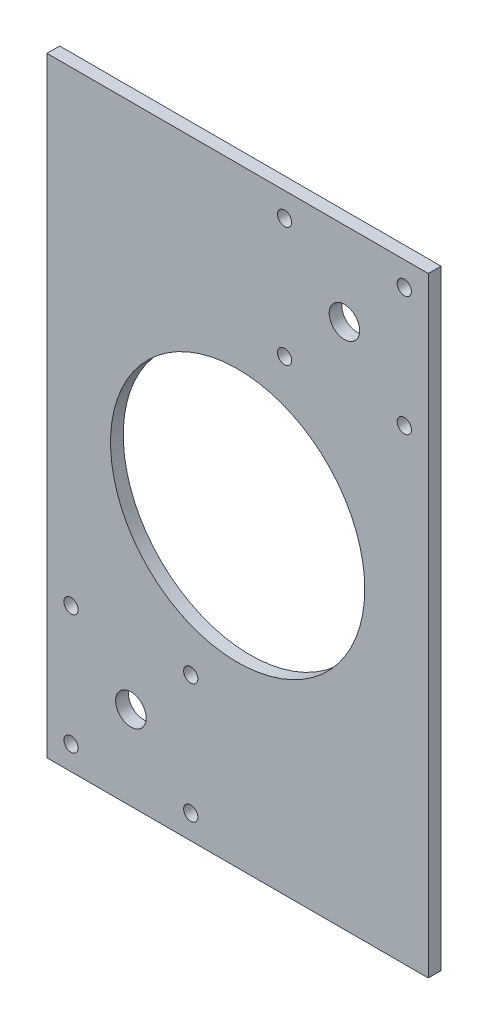
ISO-10303-21;
HEADER;
FILE_DESCRIPTION(('STEP AP214'),'2;1');
FILE_NAME('part.step','',(''),(''),'','','');
FILE_SCHEMA(('AUTOMOTIVE_DESIGN { 1 0 10303 214 1 1 1 1 }'));
ENDSEC;
DATA;
#1=APPLICATION_CONTEXT('core data for automotive mechanical design processes');
#2=APPLICATION_PROTOCOL_DEFINITION('international standard','automotive_design',2000,#1);
#3=PRODUCT_CONTEXT('',#1,'mechanical');
#4=PRODUCT('Part','Part','',(#3));
#5=PRODUCT_RELATED_PRODUCT_CATEGORY('part','',(#4));
#6=PRODUCT_DEFINITION_FORMATION('','',#4);
#7=PRODUCT_DEFINITION_CONTEXT('part definition',#1,'design');
#8=PRODUCT_DEFINITION('design','',#6,#7);
#9=PRODUCT_DEFINITION_SHAPE('','',#8);
#10=(LENGTH_UNIT() NAMED_UNIT(*) SI_UNIT(.MILLI.,.METRE.));
#11=(NAMED_UNIT(*) PLANE_ANGLE_UNIT() SI_UNIT($,.RADIAN.));
#12=(NAMED_UNIT(*) SI_UNIT($,.STERADIAN.) SOLID_ANGLE_UNIT());
#13=UNCERTAINTY_MEASURE_WITH_UNIT(LENGTH_MEASURE(1.E-05),#10,'distance_accuracy_value','');
#14=(GEOMETRIC_REPRESENTATION_CONTEXT(3) GLOBAL_UNCERTAINTY_ASSIGNED_CONTEXT((#13)) GLOBAL_UNIT_ASSIGNED_CONTEXT((#10,
#11,#12)) REPRESENTATION_CONTEXT('',''));
#15=CARTESIAN_POINT('',(0.,0.,0.));
#16=DIRECTION('',(0.,0.,1.));
#17=DIRECTION('',(1.,0.,0.));
#18=AXIS2_PLACEMENT_3D('',#15,#16,#17);
#19=CARTESIAN_POINT('',(75.,-120.,5.));
#20=DIRECTION('',(-1.,0.,0.));
#21=DIRECTION('',(0.,0.,1.));
#22=AXIS2_PLACEMENT_3D('',#19,#20,#21);
#23=PLANE('',#22);
#24=DIRECTION('',(0.,1.,0.));
#25=VECTOR('',#24,1.);
#26=CARTESIAN_POINT('',(75.,-120.,0.));
#27=LINE('',#26,#25);
#28=CARTESIAN_POINT('',(75.,-120.,0.));
#29=VERTEX_POINT('',#28);
#30=CARTESIAN_POINT('',(75.,120.,0.));
#31=VERTEX_POINT('',#30);
#32=EDGE_CURVE('E96',#29,#31,#27,.T.);
#33=ORIENTED_EDGE('',*,*,#32,.T.);
#34=DIRECTION('',(0.,0.,-1.));
#35=VECTOR('',#34,1.);
#36=CARTESIAN_POINT('',(75.,120.,5.));
#37=LINE('',#36,#35);
#38=CARTESIAN_POINT('',(75.,120.,5.));
#39=VERTEX_POINT('',#38);
#40=EDGE_CURVE('E11',#39,#31,#37,.T.);
#41=ORIENTED_EDGE('',*,*,#40,.F.);
#42=DIRECTION('',(0.,1.,0.));
#43=VECTOR('',#42,1.);
#44=CARTESIAN_POINT('',(75.,-120.,5.));
#45=LINE('',#44,#43);
#46=CARTESIAN_POINT('',(75.,-120.,5.));
#47=VERTEX_POINT('',#46);
#48=EDGE_CURVE('E84',#47,#39,#45,.T.);
#49=ORIENTED_EDGE('',*,*,#48,.F.);
#50=DIRECTION('',(0.,0.,-1.));
#51=VECTOR('',#50,1.);
#52=CARTESIAN_POINT('',(75.,-120.,5.));
#53=LINE('',#52,#51);
#54=EDGE_CURVE('E92',#47,#29,#53,.T.);
#55=ORIENTED_EDGE('',*,*,#54,.T.);
#56=EDGE_LOOP('',(#33,#41,#49,#55));
#57=FACE_BOUND('',#56,.T.);
#58=ADVANCED_FACE('F33',(#57),#23,.F.);
#59=CARTESIAN_POINT('',(-75.,120.,5.));
#60=DIRECTION('',(0.,-1.,0.));
#61=DIRECTION('',(0.,0.,-1.));
#62=AXIS2_PLACEMENT_3D('',#59,#60,#61);
#63=PLANE('',#62);
#64=DIRECTION('',(-1.,0.,0.));
#65=VECTOR('',#64,1.);
#66=CARTESIAN_POINT('',(-75.,120.,0.));
#67=LINE('',#66,#65);
#68=CARTESIAN_POINT('',(-75.,120.,0.));
#69=VERTEX_POINT('',#68);
#70=EDGE_CURVE('E88',#31,#69,#67,.T.);
#71=ORIENTED_EDGE('',*,*,#70,.T.);
#72=DIRECTION('',(0.,0.,-1.));
#73=VECTOR('',#72,1.);
#74=CARTESIAN_POINT('',(-75.,120.,5.));
#75=LINE('',#74,#73);
#76=CARTESIAN_POINT('',(-75.,120.,5.));
#77=VERTEX_POINT('',#76);
#78=EDGE_CURVE('E41',#77,#69,#75,.T.);
#79=ORIENTED_EDGE('',*,*,#78,.F.);
#80=DIRECTION('',(-1.,0.,0.));
#81=VECTOR('',#80,1.);
#82=CARTESIAN_POINT('',(-75.,120.,5.));
#83=LINE('',#82,#81);
#84=EDGE_CURVE('E79',#39,#77,#83,.T.);
#85=ORIENTED_EDGE('',*,*,#84,.F.);
#86=ORIENTED_EDGE('',*,*,#40,.T.);
#87=EDGE_LOOP('',(#71,#79,#85,#86));
#88=FACE_BOUND('',#87,.T.);
#89=ADVANCED_FACE('F87',(#88),#63,.F.);
#90=CARTESIAN_POINT('',(-75.,-120.,5.));
#91=DIRECTION('',(1.,0.,0.));
#92=DIRECTION('',(0.,0.,-1.));
#93=AXIS2_PLACEMENT_3D('',#90,#91,#92);
#94=PLANE('',#93);
#95=DIRECTION('',(0.,-1.,0.));
#96=VECTOR('',#95,1.);
#97=CARTESIAN_POINT('',(-75.,-120.,0.));
#98=LINE('',#97,#96);
#99=CARTESIAN_POINT('',(-75.,-120.,0.));
#100=VERTEX_POINT('',#99);
#101=EDGE_CURVE('E66',#69,#100,#98,.T.);
#102=ORIENTED_EDGE('',*,*,#101,.T.);
#103=DIRECTION('',(0.,0.,-1.));
#104=VECTOR('',#103,1.);
#105=CARTESIAN_POINT('',(-75.,-120.,5.));
#106=LINE('',#105,#104);
#107=CARTESIAN_POINT('',(-75.,-120.,5.));
#108=VERTEX_POINT('',#107);
#109=EDGE_CURVE('E89',#108,#100,#106,.T.);
#110=ORIENTED_EDGE('',*,*,#109,.F.);
#111=DIRECTION('',(0.,-1.,0.));
#112=VECTOR('',#111,1.);
#113=CARTESIAN_POINT('',(-75.,-120.,5.));
#114=LINE('',#113,#112);
#115=EDGE_CURVE('E82',#77,#108,#114,.T.);
#116=ORIENTED_EDGE('',*,*,#115,.F.);
#117=ORIENTED_EDGE('',*,*,#78,.T.);
#118=EDGE_LOOP('',(#102,#110,#116,#117));
#119=FACE_BOUND('',#118,.T.);
#120=ADVANCED_FACE('F90',(#119),#94,.F.);
#121=CARTESIAN_POINT('',(-75.,-120.,5.));
#122=DIRECTION('',(0.,1.,0.));
#123=DIRECTION('',(0.,0.,1.));
#124=AXIS2_PLACEMENT_3D('',#121,#122,#123);
#125=PLANE('',#124);
#126=DIRECTION('',(1.,0.,0.));
#127=VECTOR('',#126,1.);
#128=CARTESIAN_POINT('',(-75.,-120.,0.));
#129=LINE('',#128,#127);
#130=EDGE_CURVE('E72',#100,#29,#129,.T.);
#131=ORIENTED_EDGE('',*,*,#130,.T.);
#132=ORIENTED_EDGE('',*,*,#54,.F.);
#133=DIRECTION('',(1.,0.,0.));
#134=VECTOR('',#133,1.);
#135=CARTESIAN_POINT('',(-75.,-120.,5.));
#136=LINE('',#135,#134);
#137=EDGE_CURVE('E49',#108,#47,#136,.T.);
#138=ORIENTED_EDGE('',*,*,#137,.F.);
#139=ORIENTED_EDGE('',*,*,#109,.T.);
#140=EDGE_LOOP('',(#131,#132,#138,#139));
#141=FACE_BOUND('',#140,.T.);
#142=ADVANCED_FACE('F104',(#141),#125,.F.);
#143=CARTESIAN_POINT('',(0.,0.,5.));
#144=DIRECTION('',(0.,0.,-1.));
#145=DIRECTION('',(-1.,0.,0.));
#146=AXIS2_PLACEMENT_3D('',#143,#144,#145);
#147=PLANE('',#146);
#148=CARTESIAN_POINT('',(0.,0.,5.));
#149=DIRECTION('',(0.,0.,1.));
#150=DIRECTION('',(1.,0.,0.));
#151=AXIS2_PLACEMENT_3D('',#148,#149,#150);
#152=CIRCLE('',#151,50.);
#153=CARTESIAN_POINT('',(50.,0.,5.));
#154=VERTEX_POINT('',#153);
#155=EDGE_CURVE('E170',#154,#154,#152,.T.);
#156=ORIENTED_EDGE('',*,*,#155,.F.);
#157=EDGE_LOOP('',(#156));
#158=FACE_BOUND('',#157,.T.);
#159=CARTESIAN_POINT('',(18.4500000000013,110.55,5.));
#160=DIRECTION('',(0.,0.,1.));
#161=DIRECTION('',(1.,0.,0.));
#162=AXIS2_PLACEMENT_3D('',#159,#160,#161);
#163=CIRCLE('',#162,2.8);
#164=CARTESIAN_POINT('',(21.2500000000013,110.55,5.));
#165=VERTEX_POINT('',#164);
#166=EDGE_CURVE('E152',#165,#165,#163,.T.);
#167=ORIENTED_EDGE('',*,*,#166,.F.);
#168=EDGE_LOOP('',(#167));
#169=FACE_BOUND('',#168,.T.);
#170=CARTESIAN_POINT('',(18.4500000000013,63.45,5.));
#171=DIRECTION('',(0.,0.,1.));
#172=DIRECTION('',(1.,0.,0.));
#173=AXIS2_PLACEMENT_3D('',#170,#171,#172);
#174=CIRCLE('',#173,2.8);
#175=CARTESIAN_POINT('',(21.2500000000013,63.45,5.));
#176=VERTEX_POINT('',#175);
#177=EDGE_CURVE('E140',#176,#176,#174,.T.);
#178=ORIENTED_EDGE('',*,*,#177,.F.);
#179=EDGE_LOOP('',(#178));
#180=FACE_BOUND('',#179,.T.);
#181=CARTESIAN_POINT('',(65.5500000000018,63.45,5.));
#182=DIRECTION('',(0.,0.,1.));
#183=DIRECTION('',(1.,0.,0.));
#184=AXIS2_PLACEMENT_3D('',#181,#182,#183);
#185=CIRCLE('',#184,2.80000000000002);
#186=CARTESIAN_POINT('',(68.3500000000019,63.45,5.));
#187=VERTEX_POINT('',#186);
#188=EDGE_CURVE('E147',#187,#187,#185,.T.);
#189=ORIENTED_EDGE('',*,*,#188,.F.);
#190=EDGE_LOOP('',(#189));
#191=FACE_BOUND('',#190,.T.);
#192=CARTESIAN_POINT('',(-42.0000000000016,-87.,5.));
#193=DIRECTION('',(0.,0.,1.));
#194=DIRECTION('',(1.,0.,0.));
#195=AXIS2_PLACEMENT_3D('',#192,#193,#194);
#196=CIRCLE('',#195,6.);
#197=CARTESIAN_POINT('',(-36.0000000000016,-87.,5.));
#198=VERTEX_POINT('',#197);
#199=EDGE_CURVE('E158',#198,#198,#196,.T.);
#200=ORIENTED_EDGE('',*,*,#199,.F.);
#201=EDGE_LOOP('',(#200));
#202=FACE_BOUND('',#201,.T.);
#203=CARTESIAN_POINT('',(-18.4500000000013,-110.55,5.));
#204=DIRECTION('',(0.,0.,1.));
#205=DIRECTION('',(1.,0.,0.));
#206=AXIS2_PLACEMENT_3D('',#203,#204,#205);
#207=CIRCLE('',#206,2.8);
#208=CARTESIAN_POINT('',(-15.6500000000013,-110.55,5.));
#209=VERTEX_POINT('',#208);
#210=EDGE_CURVE('E128',#209,#209,#207,.T.);
#211=ORIENTED_EDGE('',*,*,#210,.F.);
#212=EDGE_LOOP('',(#211));
#213=FACE_BOUND('',#212,.T.);
#214=CARTESIAN_POINT('',(-18.4500000000013,-63.45,5.));
#215=DIRECTION('',(0.,0.,1.));
#216=DIRECTION('',(1.,0.,0.));
#217=AXIS2_PLACEMENT_3D('',#214,#215,#216);
#218=CIRCLE('',#217,2.8);
#219=CARTESIAN_POINT('',(-15.6500000000013,-63.45,5.));
#220=VERTEX_POINT('',#219);
#221=EDGE_CURVE('E116',#220,#220,#218,.T.);
#222=ORIENTED_EDGE('',*,*,#221,.F.);
#223=EDGE_LOOP('',(#222));
#224=FACE_BOUND('',#223,.T.);
#225=CARTESIAN_POINT('',(-65.5500000000018,-63.45,5.));
#226=DIRECTION('',(0.,0.,1.));
#227=DIRECTION('',(1.,0.,0.));
#228=AXIS2_PLACEMENT_3D('',#225,#226,#227);
#229=CIRCLE('',#228,2.80000000000002);
#230=CARTESIAN_POINT('',(-62.7500000000018,-63.45,5.));
#231=VERTEX_POINT('',#230);
#232=EDGE_CURVE('E123',#231,#231,#229,.T.);
#233=ORIENTED_EDGE('',*,*,#232,.F.);
#234=EDGE_LOOP('',(#233));
#235=FACE_BOUND('',#234,.T.);
#236=CARTESIAN_POINT('',(65.5500000000018,110.55,5.));
#237=DIRECTION('',(0.,0.,1.));
#238=DIRECTION('',(1.,0.,0.));
#239=AXIS2_PLACEMENT_3D('',#236,#237,#238);
#240=CIRCLE('',#239,2.79999999999999);
#241=CARTESIAN_POINT('',(68.3500000000018,110.55,5.));
#242=VERTEX_POINT('',#241);
#243=EDGE_CURVE('E134',#242,#242,#240,.T.);
#244=ORIENTED_EDGE('',*,*,#243,.F.);
#245=EDGE_LOOP('',(#244));
#246=FACE_BOUND('',#245,.T.);
#247=CARTESIAN_POINT('',(42.0000000000016,87.,5.));
#248=DIRECTION('',(0.,0.,1.));
#249=DIRECTION('',(1.,0.,0.));
#250=AXIS2_PLACEMENT_3D('',#247,#248,#249);
#251=CIRCLE('',#250,6.);
#252=CARTESIAN_POINT('',(48.0000000000016,87.,5.));
#253=VERTEX_POINT('',#252);
#254=EDGE_CURVE('E164',#253,#253,#251,.T.);
#255=ORIENTED_EDGE('',*,*,#254,.F.);
#256=EDGE_LOOP('',(#255));
#257=FACE_BOUND('',#256,.T.);
#258=CARTESIAN_POINT('',(-65.5500000000018,-110.55,5.));
#259=DIRECTION('',(0.,0.,1.));
#260=DIRECTION('',(1.,0.,0.));
#261=AXIS2_PLACEMENT_3D('',#258,#259,#260);
#262=CIRCLE('',#261,2.79999999999999);
#263=CARTESIAN_POINT('',(-62.7500000000018,-110.55,5.));
#264=VERTEX_POINT('',#263);
#265=EDGE_CURVE('E110',#264,#264,#262,.T.);
#266=ORIENTED_EDGE('',*,*,#265,.F.);
#267=EDGE_LOOP('',(#266));
#268=FACE_BOUND('',#267,.T.);
#269=ORIENTED_EDGE('',*,*,#48,.T.);
#270=ORIENTED_EDGE('',*,*,#84,.T.);
#271=ORIENTED_EDGE('',*,*,#115,.T.);
#272=ORIENTED_EDGE('',*,*,#137,.T.);
#273=EDGE_LOOP('',(#269,#270,#271,#272));
#274=FACE_BOUND('',#273,.T.);
#275=ADVANCED_FACE('F80',(#158,#169,#180,#191,#202,#213,#224,#235,#246,#257,#268,#274),#147,.F.);
#276=CARTESIAN_POINT('',(0.,0.,0.));
#277=DIRECTION('',(0.,0.,-1.));
#278=DIRECTION('',(-1.,0.,0.));
#279=AXIS2_PLACEMENT_3D('',#276,#277,#278);
#280=PLANE('',#279);
#281=CARTESIAN_POINT('',(0.,0.,0.));
#282=DIRECTION('',(0.,0.,1.));
#283=DIRECTION('',(1.,0.,0.));
#284=AXIS2_PLACEMENT_3D('',#281,#282,#283);
#285=CIRCLE('',#284,50.);
#286=CARTESIAN_POINT('',(50.,0.,0.));
#287=VERTEX_POINT('',#286);
#288=EDGE_CURVE('E167',#287,#287,#285,.T.);
#289=ORIENTED_EDGE('',*,*,#288,.T.);
#290=EDGE_LOOP('',(#289));
#291=FACE_BOUND('',#290,.T.);
#292=CARTESIAN_POINT('',(18.4500000000013,110.55,0.));
#293=DIRECTION('',(0.,0.,1.));
#294=DIRECTION('',(1.,0.,0.));
#295=AXIS2_PLACEMENT_3D('',#292,#293,#294);
#296=CIRCLE('',#295,2.8);
#297=CARTESIAN_POINT('',(21.2500000000013,110.55,0.));
#298=VERTEX_POINT('',#297);
#299=EDGE_CURVE('E144',#298,#298,#296,.T.);
#300=ORIENTED_EDGE('',*,*,#299,.T.);
#301=EDGE_LOOP('',(#300));
#302=FACE_BOUND('',#301,.T.);
#303=CARTESIAN_POINT('',(18.4500000000013,63.45,0.));
#304=DIRECTION('',(0.,0.,1.));
#305=DIRECTION('',(1.,0.,0.));
#306=AXIS2_PLACEMENT_3D('',#303,#304,#305);
#307=CIRCLE('',#306,2.8);
#308=CARTESIAN_POINT('',(21.2500000000013,63.45,0.));
#309=VERTEX_POINT('',#308);
#310=EDGE_CURVE('E143',#309,#309,#307,.T.);
#311=ORIENTED_EDGE('',*,*,#310,.T.);
#312=EDGE_LOOP('',(#311));
#313=FACE_BOUND('',#312,.T.);
#314=CARTESIAN_POINT('',(65.5500000000018,63.45,0.));
#315=DIRECTION('',(0.,0.,1.));
#316=DIRECTION('',(1.,0.,0.));
#317=AXIS2_PLACEMENT_3D('',#314,#315,#316);
#318=CIRCLE('',#317,2.80000000000002);
#319=CARTESIAN_POINT('',(68.3500000000019,63.45,0.));
#320=VERTEX_POINT('',#319);
#321=EDGE_CURVE('E137',#320,#320,#318,.T.);
#322=ORIENTED_EDGE('',*,*,#321,.T.);
#323=EDGE_LOOP('',(#322));
#324=FACE_BOUND('',#323,.T.);
#325=CARTESIAN_POINT('',(-42.0000000000016,-87.,0.));
#326=DIRECTION('',(0.,0.,1.));
#327=DIRECTION('',(1.,0.,0.));
#328=AXIS2_PLACEMENT_3D('',#325,#326,#327);
#329=CIRCLE('',#328,6.);
#330=CARTESIAN_POINT('',(-36.0000000000016,-87.,0.));
#331=VERTEX_POINT('',#330);
#332=EDGE_CURVE('E155',#331,#331,#329,.T.);
#333=ORIENTED_EDGE('',*,*,#332,.T.);
#334=EDGE_LOOP('',(#333));
#335=FACE_BOUND('',#334,.T.);
#336=CARTESIAN_POINT('',(-18.4500000000013,-110.55,0.));
#337=DIRECTION('',(0.,0.,1.));
#338=DIRECTION('',(1.,0.,0.));
#339=AXIS2_PLACEMENT_3D('',#336,#337,#338);
#340=CIRCLE('',#339,2.8);
#341=CARTESIAN_POINT('',(-15.6500000000013,-110.55,0.));
#342=VERTEX_POINT('',#341);
#343=EDGE_CURVE('E120',#342,#342,#340,.T.);
#344=ORIENTED_EDGE('',*,*,#343,.T.);
#345=EDGE_LOOP('',(#344));
#346=FACE_BOUND('',#345,.T.);
#347=CARTESIAN_POINT('',(-18.4500000000013,-63.45,0.));
#348=DIRECTION('',(0.,0.,1.));
#349=DIRECTION('',(1.,0.,0.));
#350=AXIS2_PLACEMENT_3D('',#347,#348,#349);
#351=CIRCLE('',#350,2.8);
#352=CARTESIAN_POINT('',(-15.6500000000013,-63.45,0.));
#353=VERTEX_POINT('',#352);
#354=EDGE_CURVE('E119',#353,#353,#351,.T.);
#355=ORIENTED_EDGE('',*,*,#354,.T.);
#356=EDGE_LOOP('',(#355));
#357=FACE_BOUND('',#356,.T.);
#358=CARTESIAN_POINT('',(-65.5500000000018,-63.45,0.));
#359=DIRECTION('',(0.,0.,1.));
#360=DIRECTION('',(1.,0.,0.));
#361=AXIS2_PLACEMENT_3D('',#358,#359,#360);
#362=CIRCLE('',#361,2.80000000000002);
#363=CARTESIAN_POINT('',(-62.7500000000018,-63.45,0.));
#364=VERTEX_POINT('',#363);
#365=EDGE_CURVE('E113',#364,#364,#362,.T.);
#366=ORIENTED_EDGE('',*,*,#365,.T.);
#367=EDGE_LOOP('',(#366));
#368=FACE_BOUND('',#367,.T.);
#369=CARTESIAN_POINT('',(65.5500000000018,110.55,0.));
#370=DIRECTION('',(0.,0.,1.));
#371=DIRECTION('',(1.,0.,0.));
#372=AXIS2_PLACEMENT_3D('',#369,#370,#371);
#373=CIRCLE('',#372,2.79999999999999);
#374=CARTESIAN_POINT('',(68.3500000000018,110.55,0.));
#375=VERTEX_POINT('',#374);
#376=EDGE_CURVE('E131',#375,#375,#373,.T.);
#377=ORIENTED_EDGE('',*,*,#376,.T.);
#378=EDGE_LOOP('',(#377));
#379=FACE_BOUND('',#378,.T.);
#380=CARTESIAN_POINT('',(42.0000000000016,87.,0.));
#381=DIRECTION('',(0.,0.,1.));
#382=DIRECTION('',(1.,0.,0.));
#383=AXIS2_PLACEMENT_3D('',#380,#381,#382);
#384=CIRCLE('',#383,6.);
#385=CARTESIAN_POINT('',(48.0000000000016,87.,0.));
#386=VERTEX_POINT('',#385);
#387=EDGE_CURVE('E161',#386,#386,#384,.T.);
#388=ORIENTED_EDGE('',*,*,#387,.T.);
#389=EDGE_LOOP('',(#388));
#390=FACE_BOUND('',#389,.T.);
#391=CARTESIAN_POINT('',(-65.5500000000018,-110.55,0.));
#392=DIRECTION('',(0.,0.,1.));
#393=DIRECTION('',(1.,0.,0.));
#394=AXIS2_PLACEMENT_3D('',#391,#392,#393);
#395=CIRCLE('',#394,2.79999999999999);
#396=CARTESIAN_POINT('',(-62.7500000000018,-110.55,0.));
#397=VERTEX_POINT('',#396);
#398=EDGE_CURVE('E99',#397,#397,#395,.T.);
#399=ORIENTED_EDGE('',*,*,#398,.T.);
#400=EDGE_LOOP('',(#399));
#401=FACE_BOUND('',#400,.T.);
#402=ORIENTED_EDGE('',*,*,#32,.F.);
#403=ORIENTED_EDGE('',*,*,#130,.F.);
#404=ORIENTED_EDGE('',*,*,#101,.F.);
#405=ORIENTED_EDGE('',*,*,#70,.F.);
#406=EDGE_LOOP('',(#402,#403,#404,#405));
#407=FACE_BOUND('',#406,.T.);
#408=ADVANCED_FACE('F107',(#291,#302,#313,#324,#335,#346,#357,#368,#379,#390,#401,#407),#280,.T.);
#409=CARTESIAN_POINT('',(-65.5500000000018,-110.55,0.));
#410=DIRECTION('',(0.,0.,1.));
#411=DIRECTION('',(1.,0.,0.));
#412=AXIS2_PLACEMENT_3D('',#409,#410,#411);
#413=CYLINDRICAL_SURFACE('',#412,2.79999999999999);
#414=ORIENTED_EDGE('',*,*,#398,.F.);
#415=EDGE_LOOP('',(#414));
#416=FACE_BOUND('',#415,.T.);
#417=ORIENTED_EDGE('',*,*,#265,.T.);
#418=EDGE_LOOP('',(#417));
#419=FACE_BOUND('',#418,.T.);
#420=ADVANCED_FACE('F208',(#416,#419),#413,.F.);
#421=CARTESIAN_POINT('',(42.0000000000016,87.,0.));
#422=DIRECTION('',(0.,0.,1.));
#423=DIRECTION('',(1.,0.,0.));
#424=AXIS2_PLACEMENT_3D('',#421,#422,#423);
#425=CYLINDRICAL_SURFACE('',#424,6.);
#426=ORIENTED_EDGE('',*,*,#387,.F.);
#427=EDGE_LOOP('',(#426));
#428=FACE_BOUND('',#427,.T.);
#429=ORIENTED_EDGE('',*,*,#254,.T.);
#430=EDGE_LOOP('',(#429));
#431=FACE_BOUND('',#430,.T.);
#432=ADVANCED_FACE('F210',(#428,#431),#425,.F.);
#433=CARTESIAN_POINT('',(65.5500000000018,110.55,0.));
#434=DIRECTION('',(0.,0.,1.));
#435=DIRECTION('',(1.,0.,0.));
#436=AXIS2_PLACEMENT_3D('',#433,#434,#435);
#437=CYLINDRICAL_SURFACE('',#436,2.79999999999999);
#438=ORIENTED_EDGE('',*,*,#376,.F.);
#439=EDGE_LOOP('',(#438));
#440=FACE_BOUND('',#439,.T.);
#441=ORIENTED_EDGE('',*,*,#243,.T.);
#442=EDGE_LOOP('',(#441));
#443=FACE_BOUND('',#442,.T.);
#444=ADVANCED_FACE('F217',(#440,#443),#437,.F.);
#445=CARTESIAN_POINT('',(-65.5500000000018,-63.45,0.));
#446=DIRECTION('',(0.,0.,1.));
#447=DIRECTION('',(1.,0.,0.));
#448=AXIS2_PLACEMENT_3D('',#445,#446,#447);
#449=CYLINDRICAL_SURFACE('',#448,2.80000000000002);
#450=ORIENTED_EDGE('',*,*,#365,.F.);
#451=EDGE_LOOP('',(#450));
#452=FACE_BOUND('',#451,.T.);
#453=ORIENTED_EDGE('',*,*,#232,.T.);
#454=EDGE_LOOP('',(#453));
#455=FACE_BOUND('',#454,.T.);
#456=ADVANCED_FACE('F267',(#452,#455),#449,.F.);
#457=CARTESIAN_POINT('',(-18.4500000000013,-63.45,0.));
#458=DIRECTION('',(0.,0.,1.));
#459=DIRECTION('',(1.,0.,0.));
#460=AXIS2_PLACEMENT_3D('',#457,#458,#459);
#461=CYLINDRICAL_SURFACE('',#460,2.8);
#462=ORIENTED_EDGE('',*,*,#354,.F.);
#463=EDGE_LOOP('',(#462));
#464=FACE_BOUND('',#463,.T.);
#465=ORIENTED_EDGE('',*,*,#221,.T.);
#466=EDGE_LOOP('',(#465));
#467=FACE_BOUND('',#466,.T.);
#468=ADVANCED_FACE('F276',(#464,#467),#461,.F.);
#469=CARTESIAN_POINT('',(-18.4500000000013,-110.55,0.));
#470=DIRECTION('',(0.,0.,1.));
#471=DIRECTION('',(1.,0.,0.));
#472=AXIS2_PLACEMENT_3D('',#469,#470,#471);
#473=CYLINDRICAL_SURFACE('',#472,2.8);
#474=ORIENTED_EDGE('',*,*,#343,.F.);
#475=EDGE_LOOP('',(#474));
#476=FACE_BOUND('',#475,.T.);
#477=ORIENTED_EDGE('',*,*,#210,.T.);
#478=EDGE_LOOP('',(#477));
#479=FACE_BOUND('',#478,.T.);
#480=ADVANCED_FACE('F285',(#476,#479),#473,.F.);
#481=CARTESIAN_POINT('',(-42.0000000000016,-87.,0.));
#482=DIRECTION('',(0.,0.,1.));
#483=DIRECTION('',(1.,0.,0.));
#484=AXIS2_PLACEMENT_3D('',#481,#482,#483);
#485=CYLINDRICAL_SURFACE('',#484,6.);
#486=ORIENTED_EDGE('',*,*,#332,.F.);
#487=EDGE_LOOP('',(#486));
#488=FACE_BOUND('',#487,.T.);
#489=ORIENTED_EDGE('',*,*,#199,.T.);
#490=EDGE_LOOP('',(#489));
#491=FACE_BOUND('',#490,.T.);
#492=ADVANCED_FACE('F293',(#488,#491),#485,.F.);
#493=CARTESIAN_POINT('',(65.5500000000018,63.45,0.));
#494=DIRECTION('',(0.,0.,1.));
#495=DIRECTION('',(1.,0.,0.));
#496=AXIS2_PLACEMENT_3D('',#493,#494,#495);
#497=CYLINDRICAL_SURFACE('',#496,2.80000000000002);
#498=ORIENTED_EDGE('',*,*,#321,.F.);
#499=EDGE_LOOP('',(#498));
#500=FACE_BOUND('',#499,.T.);
#501=ORIENTED_EDGE('',*,*,#188,.T.);
#502=EDGE_LOOP('',(#501));
#503=FACE_BOUND('',#502,.T.);
#504=ADVANCED_FACE('F302',(#500,#503),#497,.F.);
#505=CARTESIAN_POINT('',(18.4500000000013,63.45,0.));
#506=DIRECTION('',(0.,0.,1.));
#507=DIRECTION('',(1.,0.,0.));
#508=AXIS2_PLACEMENT_3D('',#505,#506,#507);
#509=CYLINDRICAL_SURFACE('',#508,2.8);
#510=ORIENTED_EDGE('',*,*,#310,.F.);
#511=EDGE_LOOP('',(#510));
#512=FACE_BOUND('',#511,.T.);
#513=ORIENTED_EDGE('',*,*,#177,.T.);
#514=EDGE_LOOP('',(#513));
#515=FACE_BOUND('',#514,.T.);
#516=ADVANCED_FACE('F311',(#512,#515),#509,.F.);
#517=CARTESIAN_POINT('',(18.4500000000013,110.55,0.));
#518=DIRECTION('',(0.,0.,1.));
#519=DIRECTION('',(1.,0.,0.));
#520=AXIS2_PLACEMENT_3D('',#517,#518,#519);
#521=CYLINDRICAL_SURFACE('',#520,2.8);
#522=ORIENTED_EDGE('',*,*,#299,.F.);
#523=EDGE_LOOP('',(#522));
#524=FACE_BOUND('',#523,.T.);
#525=ORIENTED_EDGE('',*,*,#166,.T.);
#526=EDGE_LOOP('',(#525));
#527=FACE_BOUND('',#526,.T.);
#528=ADVANCED_FACE('F181',(#524,#527),#521,.F.);
#529=CARTESIAN_POINT('',(0.,0.,0.));
#530=DIRECTION('',(0.,0.,1.));
#531=DIRECTION('',(1.,0.,0.));
#532=AXIS2_PLACEMENT_3D('',#529,#530,#531);
#533=CYLINDRICAL_SURFACE('',#532,50.);
#534=ORIENTED_EDGE('',*,*,#288,.F.);
#535=EDGE_LOOP('',(#534));
#536=FACE_BOUND('',#535,.T.);
#537=ORIENTED_EDGE('',*,*,#155,.T.);
#538=EDGE_LOOP('',(#537));
#539=FACE_BOUND('',#538,.T.);
#540=ADVANCED_FACE('F178',(#536,#539),#533,.F.);
#541=CLOSED_SHELL('',(#58,#89,#120,#142,#275,#408,#420,#432,#444,#456,#468,#480,#492,#504,#516,
#528,#540));
#542=MANIFOLD_SOLID_BREP('B2',#541);
#543=ADVANCED_BREP_SHAPE_REPRESENTATION('',(#18,#542),#14);
#544=SHAPE_DEFINITION_REPRESENTATION(#9,#543);
ENDSEC;
END-ISO-10303-21;
